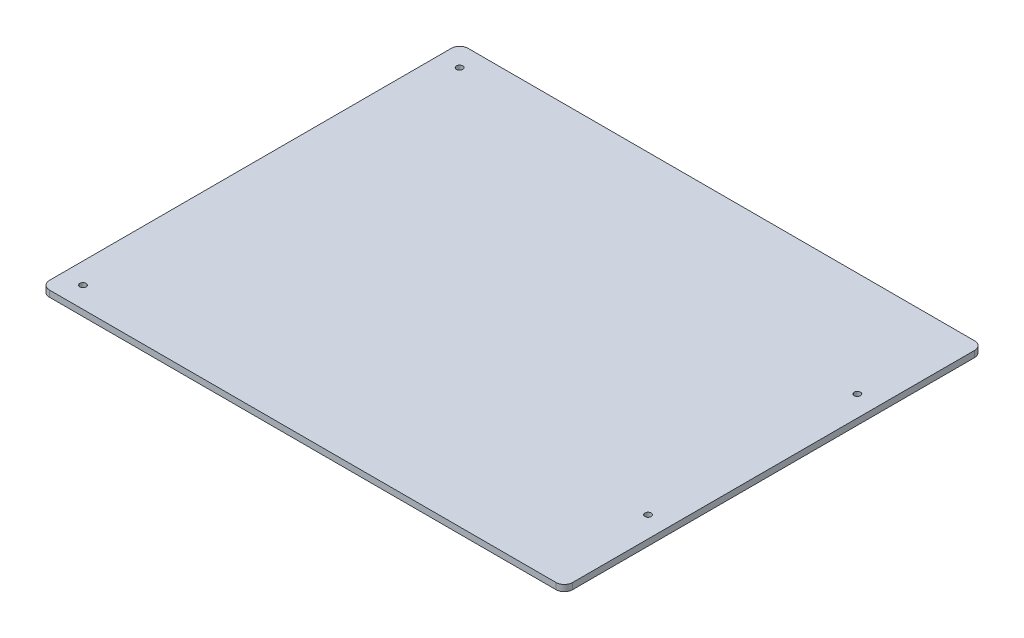
ISO-10303-21;
HEADER;
FILE_DESCRIPTION(('STEP AP214'),'2;1');
FILE_NAME('part.step','',(''),(''),'','','');
FILE_SCHEMA(('AUTOMOTIVE_DESIGN { 1 0 10303 214 1 1 1 1 }'));
ENDSEC;
DATA;
#1=APPLICATION_CONTEXT('core data for automotive mechanical design processes');
#2=APPLICATION_PROTOCOL_DEFINITION('international standard','automotive_design',2000,#1);
#3=PRODUCT_CONTEXT('',#1,'mechanical');
#4=PRODUCT('Part','Part','',(#3));
#5=PRODUCT_RELATED_PRODUCT_CATEGORY('part','',(#4));
#6=PRODUCT_DEFINITION_FORMATION('','',#4);
#7=PRODUCT_DEFINITION_CONTEXT('part definition',#1,'design');
#8=PRODUCT_DEFINITION('design','',#6,#7);
#9=PRODUCT_DEFINITION_SHAPE('','',#8);
#10=(LENGTH_UNIT() NAMED_UNIT(*) SI_UNIT(.MILLI.,.METRE.));
#11=(NAMED_UNIT(*) PLANE_ANGLE_UNIT() SI_UNIT($,.RADIAN.));
#12=(NAMED_UNIT(*) SI_UNIT($,.STERADIAN.) SOLID_ANGLE_UNIT());
#13=UNCERTAINTY_MEASURE_WITH_UNIT(LENGTH_MEASURE(1.E-05),#10,'distance_accuracy_value','');
#14=(GEOMETRIC_REPRESENTATION_CONTEXT(3) GLOBAL_UNCERTAINTY_ASSIGNED_CONTEXT((#13)) GLOBAL_UNIT_ASSIGNED_CONTEXT((#10,
#11,#12)) REPRESENTATION_CONTEXT('',''));
#15=CARTESIAN_POINT('',(0.,0.,0.));
#16=DIRECTION('',(0.,0.,1.));
#17=DIRECTION('',(1.,0.,0.));
#18=AXIS2_PLACEMENT_3D('',#15,#16,#17);
#19=CARTESIAN_POINT('',(0.,3.,0.));
#20=DIRECTION('',(0.,1.,0.));
#21=DIRECTION('',(0.,0.,1.));
#22=AXIS2_PLACEMENT_3D('',#19,#20,#21);
#23=PLANE('',#22);
#24=CARTESIAN_POINT('',(115.,3.,50.));
#25=DIRECTION('',(0.,1.,0.));
#26=DIRECTION('',(0.,0.,-1.));
#27=AXIS2_PLACEMENT_3D('',#24,#25,#26);
#28=CIRCLE('',#27,1.5);
#29=CARTESIAN_POINT('',(115.,3.,48.5));
#30=VERTEX_POINT('',#29);
#31=EDGE_CURVE('E207',#30,#30,#28,.T.);
#32=ORIENTED_EDGE('',*,*,#31,.F.);
#33=EDGE_LOOP('',(#32));
#34=FACE_BOUND('',#33,.T.);
#35=CARTESIAN_POINT('',(-115.,3.,-90.));
#36=DIRECTION('',(0.,1.,0.));
#37=DIRECTION('',(0.,0.,1.));
#38=AXIS2_PLACEMENT_3D('',#35,#36,#37);
#39=CIRCLE('',#38,1.5);
#40=CARTESIAN_POINT('',(-115.,3.,-88.5));
#41=VERTEX_POINT('',#40);
#42=EDGE_CURVE('E137',#41,#41,#39,.T.);
#43=ORIENTED_EDGE('',*,*,#42,.F.);
#44=EDGE_LOOP('',(#43));
#45=FACE_BOUND('',#44,.T.);
#46=DIRECTION('',(1.,0.,0.));
#47=VECTOR('',#46,1.);
#48=CARTESIAN_POINT('',(-125.,3.,100.));
#49=LINE('',#48,#47);
#50=CARTESIAN_POINT('',(-121.,3.,100.));
#51=VERTEX_POINT('',#50);
#52=CARTESIAN_POINT('',(121.,3.,100.));
#53=VERTEX_POINT('',#52);
#54=EDGE_CURVE('E148',#51,#53,#49,.T.);
#55=ORIENTED_EDGE('',*,*,#54,.T.);
#56=CARTESIAN_POINT('',(121.,3.,96.));
#57=DIRECTION('',(0.,1.,0.));
#58=DIRECTION('',(0.,0.,1.));
#59=AXIS2_PLACEMENT_3D('',#56,#57,#58);
#60=CIRCLE('',#59,4.);
#61=CARTESIAN_POINT('',(125.,3.,96.));
#62=VERTEX_POINT('',#61);
#63=EDGE_CURVE('E178',#53,#62,#60,.T.);
#64=ORIENTED_EDGE('',*,*,#63,.T.);
#65=DIRECTION('',(0.,0.,-1.));
#66=VECTOR('',#65,1.);
#67=CARTESIAN_POINT('',(125.,3.,-100.));
#68=LINE('',#67,#66);
#69=CARTESIAN_POINT('',(125.,3.,-96.));
#70=VERTEX_POINT('',#69);
#71=EDGE_CURVE('E127',#62,#70,#68,.T.);
#72=ORIENTED_EDGE('',*,*,#71,.T.);
#73=CARTESIAN_POINT('',(121.,3.,-96.));
#74=DIRECTION('',(0.,1.,0.));
#75=DIRECTION('',(0.,0.,1.));
#76=AXIS2_PLACEMENT_3D('',#73,#74,#75);
#77=CIRCLE('',#76,4.);
#78=CARTESIAN_POINT('',(121.,3.,-100.));
#79=VERTEX_POINT('',#78);
#80=EDGE_CURVE('E175',#70,#79,#77,.T.);
#81=ORIENTED_EDGE('',*,*,#80,.T.);
#82=DIRECTION('',(-1.,0.,0.));
#83=VECTOR('',#82,1.);
#84=CARTESIAN_POINT('',(-125.,3.,-100.));
#85=LINE('',#84,#83);
#86=CARTESIAN_POINT('',(-121.,3.,-100.));
#87=VERTEX_POINT('',#86);
#88=EDGE_CURVE('E193',#79,#87,#85,.T.);
#89=ORIENTED_EDGE('',*,*,#88,.T.);
#90=CARTESIAN_POINT('',(-121.,3.,-96.));
#91=DIRECTION('',(0.,1.,0.));
#92=DIRECTION('',(0.,0.,1.));
#93=AXIS2_PLACEMENT_3D('',#90,#91,#92);
#94=CIRCLE('',#93,4.);
#95=CARTESIAN_POINT('',(-125.,3.,-96.));
#96=VERTEX_POINT('',#95);
#97=EDGE_CURVE('E61',#87,#96,#94,.T.);
#98=ORIENTED_EDGE('',*,*,#97,.T.);
#99=DIRECTION('',(0.,0.,1.));
#100=VECTOR('',#99,1.);
#101=CARTESIAN_POINT('',(-125.,3.,-100.));
#102=LINE('',#101,#100);
#103=CARTESIAN_POINT('',(-125.,3.,96.));
#104=VERTEX_POINT('',#103);
#105=EDGE_CURVE('E191',#96,#104,#102,.T.);
#106=ORIENTED_EDGE('',*,*,#105,.T.);
#107=CARTESIAN_POINT('',(-121.,3.,96.));
#108=DIRECTION('',(0.,1.,0.));
#109=DIRECTION('',(0.,0.,1.));
#110=AXIS2_PLACEMENT_3D('',#107,#108,#109);
#111=CIRCLE('',#110,4.);
#112=EDGE_CURVE('E170',#104,#51,#111,.T.);
#113=ORIENTED_EDGE('',*,*,#112,.T.);
#114=EDGE_LOOP('',(#55,#64,#72,#81,#89,#98,#106,#113));
#115=FACE_BOUND('',#114,.T.);
#116=CARTESIAN_POINT('',(115.,3.,-50.));
#117=DIRECTION('',(0.,1.,0.));
#118=DIRECTION('',(0.,0.,1.));
#119=AXIS2_PLACEMENT_3D('',#116,#117,#118);
#120=CIRCLE('',#119,1.5);
#121=CARTESIAN_POINT('',(115.,3.,-48.5));
#122=VERTEX_POINT('',#121);
#123=EDGE_CURVE('E201',#122,#122,#120,.T.);
#124=ORIENTED_EDGE('',*,*,#123,.F.);
#125=EDGE_LOOP('',(#124));
#126=FACE_BOUND('',#125,.T.);
#127=CARTESIAN_POINT('',(-115.,3.,90.));
#128=DIRECTION('',(0.,1.,0.));
#129=DIRECTION('',(0.,0.,-1.));
#130=AXIS2_PLACEMENT_3D('',#127,#128,#129);
#131=CIRCLE('',#130,1.5);
#132=CARTESIAN_POINT('',(-115.,3.,88.5));
#133=VERTEX_POINT('',#132);
#134=EDGE_CURVE('E215',#133,#133,#131,.T.);
#135=ORIENTED_EDGE('',*,*,#134,.F.);
#136=EDGE_LOOP('',(#135));
#137=FACE_BOUND('',#136,.T.);
#138=ADVANCED_FACE('F39',(#34,#45,#115,#126,#137),#23,.T.);
#139=CARTESIAN_POINT('',(0.,0.,0.));
#140=DIRECTION('',(0.,1.,0.));
#141=DIRECTION('',(0.,0.,1.));
#142=AXIS2_PLACEMENT_3D('',#139,#140,#141);
#143=PLANE('',#142);
#144=DIRECTION('',(0.,0.,-1.));
#145=VECTOR('',#144,1.);
#146=CARTESIAN_POINT('',(125.,0.,-100.));
#147=LINE('',#146,#145);
#148=CARTESIAN_POINT('',(125.,0.,96.));
#149=VERTEX_POINT('',#148);
#150=CARTESIAN_POINT('',(125.,0.,-96.));
#151=VERTEX_POINT('',#150);
#152=EDGE_CURVE('E124',#149,#151,#147,.T.);
#153=ORIENTED_EDGE('',*,*,#152,.F.);
#154=CARTESIAN_POINT('',(121.,0.,96.));
#155=DIRECTION('',(0.,1.,0.));
#156=DIRECTION('',(0.,0.,1.));
#157=AXIS2_PLACEMENT_3D('',#154,#155,#156);
#158=CIRCLE('',#157,4.);
#159=CARTESIAN_POINT('',(121.,0.,100.));
#160=VERTEX_POINT('',#159);
#161=EDGE_CURVE('E106',#149,#160,#158,.F.);
#162=ORIENTED_EDGE('',*,*,#161,.T.);
#163=DIRECTION('',(1.,0.,0.));
#164=VECTOR('',#163,1.);
#165=CARTESIAN_POINT('',(-125.,0.,100.));
#166=LINE('',#165,#164);
#167=CARTESIAN_POINT('',(-121.,0.,100.));
#168=VERTEX_POINT('',#167);
#169=EDGE_CURVE('E153',#168,#160,#166,.T.);
#170=ORIENTED_EDGE('',*,*,#169,.F.);
#171=CARTESIAN_POINT('',(-121.,0.,96.));
#172=DIRECTION('',(0.,1.,0.));
#173=DIRECTION('',(0.,0.,1.));
#174=AXIS2_PLACEMENT_3D('',#171,#172,#173);
#175=CIRCLE('',#174,4.);
#176=CARTESIAN_POINT('',(-125.,0.,96.));
#177=VERTEX_POINT('',#176);
#178=EDGE_CURVE('E129',#168,#177,#175,.F.);
#179=ORIENTED_EDGE('',*,*,#178,.T.);
#180=DIRECTION('',(0.,0.,1.));
#181=VECTOR('',#180,1.);
#182=CARTESIAN_POINT('',(-125.,0.,-100.));
#183=LINE('',#182,#181);
#184=CARTESIAN_POINT('',(-125.,0.,-96.));
#185=VERTEX_POINT('',#184);
#186=EDGE_CURVE('E142',#185,#177,#183,.T.);
#187=ORIENTED_EDGE('',*,*,#186,.F.);
#188=CARTESIAN_POINT('',(-121.,0.,-96.));
#189=DIRECTION('',(0.,1.,0.));
#190=DIRECTION('',(0.,0.,1.));
#191=AXIS2_PLACEMENT_3D('',#188,#189,#190);
#192=CIRCLE('',#191,4.);
#193=CARTESIAN_POINT('',(-121.,0.,-100.));
#194=VERTEX_POINT('',#193);
#195=EDGE_CURVE('E160',#185,#194,#192,.F.);
#196=ORIENTED_EDGE('',*,*,#195,.T.);
#197=DIRECTION('',(-1.,0.,0.));
#198=VECTOR('',#197,1.);
#199=CARTESIAN_POINT('',(-125.,0.,-100.));
#200=LINE('',#199,#198);
#201=CARTESIAN_POINT('',(121.,0.,-100.));
#202=VERTEX_POINT('',#201);
#203=EDGE_CURVE('E136',#202,#194,#200,.T.);
#204=ORIENTED_EDGE('',*,*,#203,.F.);
#205=CARTESIAN_POINT('',(121.,0.,-96.));
#206=DIRECTION('',(0.,1.,0.));
#207=DIRECTION('',(0.,0.,1.));
#208=AXIS2_PLACEMENT_3D('',#205,#206,#207);
#209=CIRCLE('',#208,4.);
#210=EDGE_CURVE('E118',#202,#151,#209,.F.);
#211=ORIENTED_EDGE('',*,*,#210,.T.);
#212=EDGE_LOOP('',(#153,#162,#170,#179,#187,#196,#204,#211));
#213=FACE_BOUND('',#212,.T.);
#214=CARTESIAN_POINT('',(-115.,0.,-90.));
#215=DIRECTION('',(0.,1.,0.));
#216=DIRECTION('',(0.,0.,1.));
#217=AXIS2_PLACEMENT_3D('',#214,#215,#216);
#218=CIRCLE('',#217,1.5);
#219=CARTESIAN_POINT('',(-115.,0.,-88.5));
#220=VERTEX_POINT('',#219);
#221=EDGE_CURVE('E145',#220,#220,#218,.T.);
#222=ORIENTED_EDGE('',*,*,#221,.T.);
#223=EDGE_LOOP('',(#222));
#224=FACE_BOUND('',#223,.T.);
#225=CARTESIAN_POINT('',(115.,0.,-50.));
#226=DIRECTION('',(0.,1.,0.));
#227=DIRECTION('',(0.,0.,1.));
#228=AXIS2_PLACEMENT_3D('',#225,#226,#227);
#229=CIRCLE('',#228,1.5);
#230=CARTESIAN_POINT('',(115.,0.,-48.5));
#231=VERTEX_POINT('',#230);
#232=EDGE_CURVE('E203',#231,#231,#229,.T.);
#233=ORIENTED_EDGE('',*,*,#232,.T.);
#234=EDGE_LOOP('',(#233));
#235=FACE_BOUND('',#234,.T.);
#236=CARTESIAN_POINT('',(115.,0.,50.));
#237=DIRECTION('',(0.,1.,0.));
#238=DIRECTION('',(0.,0.,-1.));
#239=AXIS2_PLACEMENT_3D('',#236,#237,#238);
#240=CIRCLE('',#239,1.5);
#241=CARTESIAN_POINT('',(115.,0.,48.5));
#242=VERTEX_POINT('',#241);
#243=EDGE_CURVE('E211',#242,#242,#240,.T.);
#244=ORIENTED_EDGE('',*,*,#243,.T.);
#245=EDGE_LOOP('',(#244));
#246=FACE_BOUND('',#245,.T.);
#247=CARTESIAN_POINT('',(-115.,0.,90.));
#248=DIRECTION('',(0.,1.,0.));
#249=DIRECTION('',(0.,0.,-1.));
#250=AXIS2_PLACEMENT_3D('',#247,#248,#249);
#251=CIRCLE('',#250,1.5);
#252=CARTESIAN_POINT('',(-115.,0.,88.5));
#253=VERTEX_POINT('',#252);
#254=EDGE_CURVE('E219',#253,#253,#251,.T.);
#255=ORIENTED_EDGE('',*,*,#254,.T.);
#256=EDGE_LOOP('',(#255));
#257=FACE_BOUND('',#256,.T.);
#258=ADVANCED_FACE('F132',(#213,#224,#235,#246,#257),#143,.F.);
#259=CARTESIAN_POINT('',(125.,3.,-100.));
#260=DIRECTION('',(-1.,0.,0.));
#261=DIRECTION('',(0.,0.,1.));
#262=AXIS2_PLACEMENT_3D('',#259,#260,#261);
#263=PLANE('',#262);
#264=ORIENTED_EDGE('',*,*,#71,.F.);
#265=DIRECTION('',(0.,-1.,0.));
#266=VECTOR('',#265,1.);
#267=CARTESIAN_POINT('',(125.,3.,96.));
#268=LINE('',#267,#266);
#269=EDGE_CURVE('E110',#62,#149,#268,.T.);
#270=ORIENTED_EDGE('',*,*,#269,.T.);
#271=ORIENTED_EDGE('',*,*,#152,.T.);
#272=DIRECTION('',(0.,-1.,0.));
#273=VECTOR('',#272,1.);
#274=CARTESIAN_POINT('',(125.,3.,-96.));
#275=LINE('',#274,#273);
#276=EDGE_CURVE('E130',#151,#70,#275,.F.);
#277=ORIENTED_EDGE('',*,*,#276,.T.);
#278=EDGE_LOOP('',(#264,#270,#271,#277));
#279=FACE_BOUND('',#278,.T.);
#280=ADVANCED_FACE('F123',(#279),#263,.F.);
#281=CARTESIAN_POINT('',(-125.,3.,-100.));
#282=DIRECTION('',(0.,0.,1.));
#283=DIRECTION('',(1.,0.,0.));
#284=AXIS2_PLACEMENT_3D('',#281,#282,#283);
#285=PLANE('',#284);
#286=ORIENTED_EDGE('',*,*,#88,.F.);
#287=DIRECTION('',(0.,-1.,0.));
#288=VECTOR('',#287,1.);
#289=CARTESIAN_POINT('',(121.,3.,-100.));
#290=LINE('',#289,#288);
#291=EDGE_CURVE('E184',#79,#202,#290,.T.);
#292=ORIENTED_EDGE('',*,*,#291,.T.);
#293=ORIENTED_EDGE('',*,*,#203,.T.);
#294=DIRECTION('',(0.,-1.,0.));
#295=VECTOR('',#294,1.);
#296=CARTESIAN_POINT('',(-121.,3.,-100.));
#297=LINE('',#296,#295);
#298=EDGE_CURVE('E181',#194,#87,#297,.F.);
#299=ORIENTED_EDGE('',*,*,#298,.T.);
#300=EDGE_LOOP('',(#286,#292,#293,#299));
#301=FACE_BOUND('',#300,.T.);
#302=ADVANCED_FACE('F250',(#301),#285,.F.);
#303=CARTESIAN_POINT('',(-125.,3.,-100.));
#304=DIRECTION('',(1.,0.,0.));
#305=DIRECTION('',(0.,0.,-1.));
#306=AXIS2_PLACEMENT_3D('',#303,#304,#305);
#307=PLANE('',#306);
#308=ORIENTED_EDGE('',*,*,#105,.F.);
#309=DIRECTION('',(0.,-1.,0.));
#310=VECTOR('',#309,1.);
#311=CARTESIAN_POINT('',(-125.,3.,-96.));
#312=LINE('',#311,#310);
#313=EDGE_CURVE('E11',#96,#185,#312,.T.);
#314=ORIENTED_EDGE('',*,*,#313,.T.);
#315=ORIENTED_EDGE('',*,*,#186,.T.);
#316=DIRECTION('',(0.,-1.,0.));
#317=VECTOR('',#316,1.);
#318=CARTESIAN_POINT('',(-125.,3.,96.));
#319=LINE('',#318,#317);
#320=EDGE_CURVE('E48',#177,#104,#319,.F.);
#321=ORIENTED_EDGE('',*,*,#320,.T.);
#322=EDGE_LOOP('',(#308,#314,#315,#321));
#323=FACE_BOUND('',#322,.T.);
#324=ADVANCED_FACE('F246',(#323),#307,.F.);
#325=CARTESIAN_POINT('',(-125.,3.,100.));
#326=DIRECTION('',(0.,0.,-1.));
#327=DIRECTION('',(-1.,0.,0.));
#328=AXIS2_PLACEMENT_3D('',#325,#326,#327);
#329=PLANE('',#328);
#330=ORIENTED_EDGE('',*,*,#169,.T.);
#331=DIRECTION('',(0.,-1.,0.));
#332=VECTOR('',#331,1.);
#333=CARTESIAN_POINT('',(121.,3.,100.));
#334=LINE('',#333,#332);
#335=EDGE_CURVE('E111',#160,#53,#334,.F.);
#336=ORIENTED_EDGE('',*,*,#335,.T.);
#337=ORIENTED_EDGE('',*,*,#54,.F.);
#338=DIRECTION('',(0.,-1.,0.));
#339=VECTOR('',#338,1.);
#340=CARTESIAN_POINT('',(-121.,3.,100.));
#341=LINE('',#340,#339);
#342=EDGE_CURVE('E117',#51,#168,#341,.T.);
#343=ORIENTED_EDGE('',*,*,#342,.T.);
#344=EDGE_LOOP('',(#330,#336,#337,#343));
#345=FACE_BOUND('',#344,.T.);
#346=ADVANCED_FACE('F243',(#345),#329,.F.);
#347=CARTESIAN_POINT('',(-115.,3.,-90.));
#348=DIRECTION('',(0.,-1.,0.));
#349=DIRECTION('',(0.,0.,-1.));
#350=AXIS2_PLACEMENT_3D('',#347,#348,#349);
#351=CYLINDRICAL_SURFACE('',#350,1.5);
#352=ORIENTED_EDGE('',*,*,#42,.T.);
#353=EDGE_LOOP('',(#352));
#354=FACE_BOUND('',#353,.T.);
#355=ORIENTED_EDGE('',*,*,#221,.F.);
#356=EDGE_LOOP('',(#355));
#357=FACE_BOUND('',#356,.T.);
#358=ADVANCED_FACE('F240',(#354,#357),#351,.F.);
#359=CARTESIAN_POINT('',(115.,3.,-50.));
#360=DIRECTION('',(0.,-1.,0.));
#361=DIRECTION('',(0.,0.,-1.));
#362=AXIS2_PLACEMENT_3D('',#359,#360,#361);
#363=CYLINDRICAL_SURFACE('',#362,1.5);
#364=ORIENTED_EDGE('',*,*,#123,.T.);
#365=EDGE_LOOP('',(#364));
#366=FACE_BOUND('',#365,.T.);
#367=ORIENTED_EDGE('',*,*,#232,.F.);
#368=EDGE_LOOP('',(#367));
#369=FACE_BOUND('',#368,.T.);
#370=ADVANCED_FACE('F277',(#366,#369),#363,.F.);
#371=CARTESIAN_POINT('',(115.,3.,50.));
#372=DIRECTION('',(0.,-1.,0.));
#373=DIRECTION('',(0.,0.,-1.));
#374=AXIS2_PLACEMENT_3D('',#371,#372,#373);
#375=CYLINDRICAL_SURFACE('',#374,1.5);
#376=ORIENTED_EDGE('',*,*,#31,.T.);
#377=EDGE_LOOP('',(#376));
#378=FACE_BOUND('',#377,.T.);
#379=ORIENTED_EDGE('',*,*,#243,.F.);
#380=EDGE_LOOP('',(#379));
#381=FACE_BOUND('',#380,.T.);
#382=ADVANCED_FACE('F280',(#378,#381),#375,.F.);
#383=CARTESIAN_POINT('',(-115.,3.,90.));
#384=DIRECTION('',(0.,-1.,0.));
#385=DIRECTION('',(0.,0.,-1.));
#386=AXIS2_PLACEMENT_3D('',#383,#384,#385);
#387=CYLINDRICAL_SURFACE('',#386,1.5);
#388=ORIENTED_EDGE('',*,*,#134,.T.);
#389=EDGE_LOOP('',(#388));
#390=FACE_BOUND('',#389,.T.);
#391=ORIENTED_EDGE('',*,*,#254,.F.);
#392=EDGE_LOOP('',(#391));
#393=FACE_BOUND('',#392,.T.);
#394=ADVANCED_FACE('F227',(#390,#393),#387,.F.);
#395=CARTESIAN_POINT('',(121.,3.,96.));
#396=DIRECTION('',(0.,-1.,0.));
#397=DIRECTION('',(0.,0.,-1.));
#398=AXIS2_PLACEMENT_3D('',#395,#396,#397);
#399=CYLINDRICAL_SURFACE('',#398,4.);
#400=ORIENTED_EDGE('',*,*,#63,.F.);
#401=ORIENTED_EDGE('',*,*,#335,.F.);
#402=ORIENTED_EDGE('',*,*,#161,.F.);
#403=ORIENTED_EDGE('',*,*,#269,.F.);
#404=EDGE_LOOP('',(#400,#401,#402,#403));
#405=FACE_BOUND('',#404,.T.);
#406=ADVANCED_FACE('F109',(#405),#399,.T.);
#407=CARTESIAN_POINT('',(121.,3.,-96.));
#408=DIRECTION('',(0.,-1.,0.));
#409=DIRECTION('',(0.,0.,-1.));
#410=AXIS2_PLACEMENT_3D('',#407,#408,#409);
#411=CYLINDRICAL_SURFACE('',#410,4.);
#412=ORIENTED_EDGE('',*,*,#80,.F.);
#413=ORIENTED_EDGE('',*,*,#276,.F.);
#414=ORIENTED_EDGE('',*,*,#210,.F.);
#415=ORIENTED_EDGE('',*,*,#291,.F.);
#416=EDGE_LOOP('',(#412,#413,#414,#415));
#417=FACE_BOUND('',#416,.T.);
#418=ADVANCED_FACE('F258',(#417),#411,.T.);
#419=CARTESIAN_POINT('',(-121.,3.,-96.));
#420=DIRECTION('',(0.,-1.,0.));
#421=DIRECTION('',(0.,0.,-1.));
#422=AXIS2_PLACEMENT_3D('',#419,#420,#421);
#423=CYLINDRICAL_SURFACE('',#422,4.);
#424=ORIENTED_EDGE('',*,*,#97,.F.);
#425=ORIENTED_EDGE('',*,*,#298,.F.);
#426=ORIENTED_EDGE('',*,*,#195,.F.);
#427=ORIENTED_EDGE('',*,*,#313,.F.);
#428=EDGE_LOOP('',(#424,#425,#426,#427));
#429=FACE_BOUND('',#428,.T.);
#430=ADVANCED_FACE('F260',(#429),#423,.T.);
#431=CARTESIAN_POINT('',(-121.,3.,96.));
#432=DIRECTION('',(0.,-1.,0.));
#433=DIRECTION('',(0.,0.,-1.));
#434=AXIS2_PLACEMENT_3D('',#431,#432,#433);
#435=CYLINDRICAL_SURFACE('',#434,4.);
#436=ORIENTED_EDGE('',*,*,#112,.F.);
#437=ORIENTED_EDGE('',*,*,#320,.F.);
#438=ORIENTED_EDGE('',*,*,#178,.F.);
#439=ORIENTED_EDGE('',*,*,#342,.F.);
#440=EDGE_LOOP('',(#436,#437,#438,#439));
#441=FACE_BOUND('',#440,.T.);
#442=ADVANCED_FACE('F41',(#441),#435,.T.);
#443=CLOSED_SHELL('',(#138,#258,#280,#302,#324,#346,#358,#370,#382,#394,#406,#418,#430,#442));
#444=MANIFOLD_SOLID_BREP('B2',#443);
#445=ADVANCED_BREP_SHAPE_REPRESENTATION('',(#18,#444),#14);
#446=SHAPE_DEFINITION_REPRESENTATION(#9,#445);
ENDSEC;
END-ISO-10303-21;
